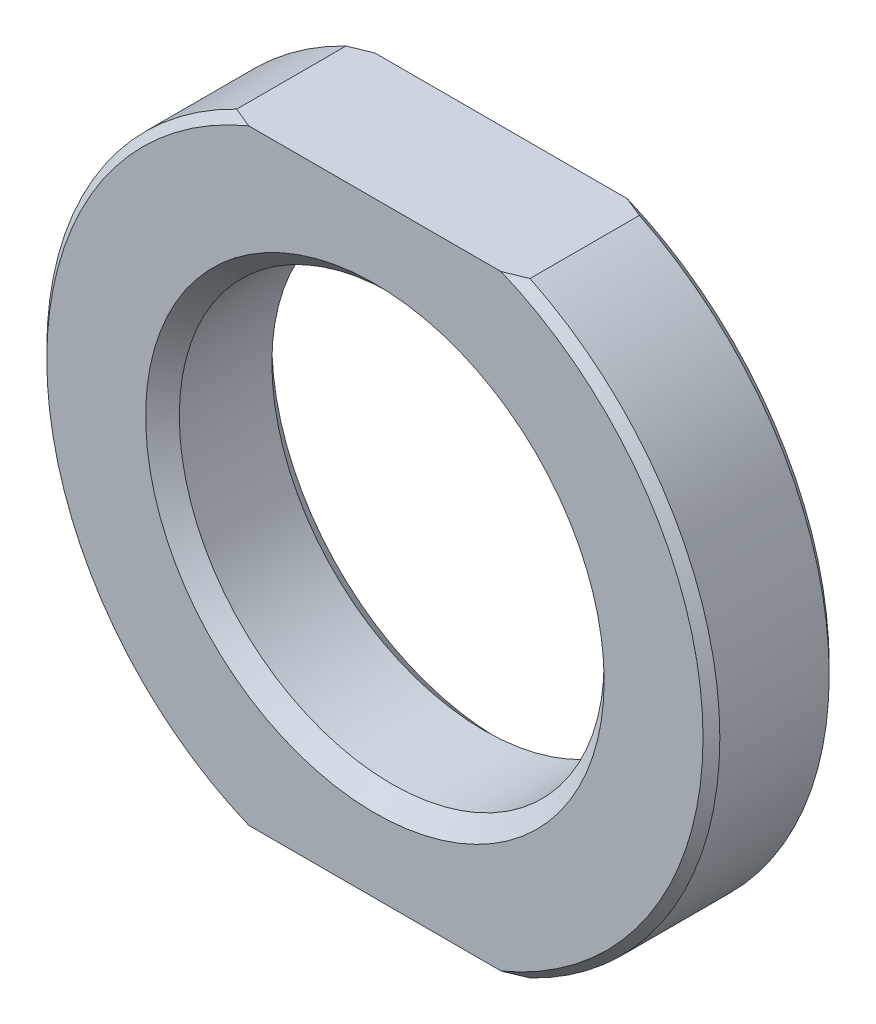
ISO-10303-21;
HEADER;
FILE_DESCRIPTION(('STEP AP214'),'2;1');
FILE_NAME('part.step','',(''),(''),'','','');
FILE_SCHEMA(('AUTOMOTIVE_DESIGN { 1 0 10303 214 1 1 1 1 }'));
ENDSEC;
DATA;
#1=APPLICATION_CONTEXT('core data for automotive mechanical design processes');
#2=APPLICATION_PROTOCOL_DEFINITION('international standard','automotive_design',2000,#1);
#3=PRODUCT_CONTEXT('',#1,'mechanical');
#4=PRODUCT('Part','Part','',(#3));
#5=PRODUCT_RELATED_PRODUCT_CATEGORY('part','',(#4));
#6=PRODUCT_DEFINITION_FORMATION('','',#4);
#7=PRODUCT_DEFINITION_CONTEXT('part definition',#1,'design');
#8=PRODUCT_DEFINITION('design','',#6,#7);
#9=PRODUCT_DEFINITION_SHAPE('','',#8);
#10=(LENGTH_UNIT() NAMED_UNIT(*) SI_UNIT(.MILLI.,.METRE.));
#11=(NAMED_UNIT(*) PLANE_ANGLE_UNIT() SI_UNIT($,.RADIAN.));
#12=(NAMED_UNIT(*) SI_UNIT($,.STERADIAN.) SOLID_ANGLE_UNIT());
#13=UNCERTAINTY_MEASURE_WITH_UNIT(LENGTH_MEASURE(1.E-05),#10,'distance_accuracy_value','');
#14=(GEOMETRIC_REPRESENTATION_CONTEXT(3) GLOBAL_UNCERTAINTY_ASSIGNED_CONTEXT((#13)) GLOBAL_UNIT_ASSIGNED_CONTEXT((#10,
#11,#12)) REPRESENTATION_CONTEXT('',''));
#15=CARTESIAN_POINT('',(0.,0.,0.));
#16=DIRECTION('',(0.,0.,1.));
#17=DIRECTION('',(1.,0.,0.));
#18=AXIS2_PLACEMENT_3D('',#15,#16,#17);
#19=CARTESIAN_POINT('',(0.,0.,15.));
#20=DIRECTION('',(0.,0.,-1.));
#21=DIRECTION('',(-1.,0.,0.));
#22=AXIS2_PLACEMENT_3D('',#19,#20,#21);
#23=CYLINDRICAL_SURFACE('',#22,40.);
#24=CARTESIAN_POINT('',(0.,0.,14.));
#25=DIRECTION('',(0.,0.,1.));
#26=DIRECTION('',(1.,0.,0.));
#27=AXIS2_PLACEMENT_3D('',#24,#25,#26);
#28=CIRCLE('',#27,40.);
#29=CARTESIAN_POINT('',(17.4355957741627,36.,14.));
#30=VERTEX_POINT('',#29);
#31=CARTESIAN_POINT('',(17.4355957741627,-36.,14.));
#32=VERTEX_POINT('',#31);
#33=EDGE_CURVE('E113',#30,#32,#28,.F.);
#34=ORIENTED_EDGE('',*,*,#33,.T.);
#35=DIRECTION('',(0.,0.,-1.));
#36=VECTOR('',#35,1.);
#37=CARTESIAN_POINT('',(17.4355957741627,-36.,15.));
#38=LINE('',#37,#36);
#39=CARTESIAN_POINT('',(17.4355957741627,-36.,0.999999999999994));
#40=VERTEX_POINT('',#39);
#41=EDGE_CURVE('E97',#40,#32,#38,.F.);
#42=ORIENTED_EDGE('',*,*,#41,.F.);
#43=CARTESIAN_POINT('',(0.,0.,0.999999999999994));
#44=DIRECTION('',(0.,0.,1.));
#45=DIRECTION('',(1.,0.,0.));
#46=AXIS2_PLACEMENT_3D('',#43,#44,#45);
#47=CIRCLE('',#46,40.);
#48=CARTESIAN_POINT('',(17.4355957741627,36.,0.999999999999994));
#49=VERTEX_POINT('',#48);
#50=EDGE_CURVE('E125',#40,#49,#47,.T.);
#51=ORIENTED_EDGE('',*,*,#50,.T.);
#52=DIRECTION('',(0.,0.,-1.));
#53=VECTOR('',#52,1.);
#54=CARTESIAN_POINT('',(17.4355957741627,36.,15.));
#55=LINE('',#54,#53);
#56=EDGE_CURVE('E119',#30,#49,#55,.T.);
#57=ORIENTED_EDGE('',*,*,#56,.F.);
#58=EDGE_LOOP('',(#34,#42,#51,#57));
#59=FACE_BOUND('',#58,.T.);
#60=ADVANCED_FACE('F34',(#59),#23,.T.);
#61=CARTESIAN_POINT('',(0.,0.,15.));
#62=DIRECTION('',(0.,0.,-1.));
#63=DIRECTION('',(-1.,0.,0.));
#64=AXIS2_PLACEMENT_3D('',#61,#62,#63);
#65=CONICAL_SURFACE('',#64,39.,0.785398163397438);
#66=CARTESIAN_POINT('',(-77.825600004695,-36.,-31.7486094119954));
#67=CARTESIAN_POINT('',(-76.6881741281828,-36.,-30.7163120926248));
#68=CARTESIAN_POINT('',(-75.5487915250788,-36.,-29.6861648322509));
#69=CARTESIAN_POINT('',(-73.2655470649654,-36.,-27.6308257342061));
#70=CARTESIAN_POINT('',(-72.1216851662086,-36.,-26.6056339429207));
#71=CARTESIAN_POINT('',(-69.8286249351588,-36.,-24.5606016035495));
#72=CARTESIAN_POINT('',(-68.6794252327062,-36.,-23.5407625909587));
#73=CARTESIAN_POINT('',(-66.3753243492236,-36.,-21.5075480323083));
#74=CARTESIAN_POINT('',(-65.2204231815443,-36.,-20.4941724711265));
#75=CARTESIAN_POINT('',(-62.8943951622492,-36.,-18.4663890947174));
#76=CARTESIAN_POINT('',(-61.7232135038202,-36.,-17.4520441078319));
#77=CARTESIAN_POINT('',(-59.3732783640983,-36.,-15.4321648820889));
#78=CARTESIAN_POINT('',(-58.194524909544,-36.,-14.4266306121472));
#79=CARTESIAN_POINT('',(-55.8284448889604,-36.,-12.4260209809316));
#80=CARTESIAN_POINT('',(-54.6411195184891,-36.,-11.430944206899));
#81=CARTESIAN_POINT('',(-52.256346114857,-36.,-9.45298868945021));
#82=CARTESIAN_POINT('',(-51.0588981218762,-36.,-8.47010989765447));
#83=CARTESIAN_POINT('',(-48.8046599535697,-36.,-6.6425304791211));
#84=CARTESIAN_POINT('',(-47.7492720948121,-36.,-5.79610151498913));
#85=CARTESIAN_POINT('',(-45.6281233248411,-36.,-4.11631502947676));
#86=CARTESIAN_POINT('',(-44.5623623709865,-36.,-3.28295756186667));
#87=CARTESIAN_POINT('',(-42.418469831393,-36.,-1.63145768460364));
#88=CARTESIAN_POINT('',(-41.3403338250807,-36.,-0.81332100404254));
#89=CARTESIAN_POINT('',(-39.1701727531055,-36.,0.804332167596225));
#90=CARTESIAN_POINT('',(-38.0781478370549,-36.,1.60384885898725));
#91=CARTESIAN_POINT('',(-35.8799087250404,-36.,3.1789329586558));
#92=CARTESIAN_POINT('',(-34.7737238248943,-36.,3.95454113719093));
#93=CARTESIAN_POINT('',(-32.5424990953004,-36.,5.47835548541539));
#94=CARTESIAN_POINT('',(-31.4174581969774,-36.,6.22656009399011));
#95=CARTESIAN_POINT('',(-29.1461314339693,-36.,7.68864629136478));
#96=CARTESIAN_POINT('',(-27.9998591873698,-36.,8.40254889309455));
#97=CARTESIAN_POINT('',(-26.2615414746248,-36.,9.44157261170722));
#98=CARTESIAN_POINT('',(-25.6789796206342,-36.,9.78259292760825));
#99=CARTESIAN_POINT('',(-24.5070590262419,-36.,10.4527303791024));
#100=CARTESIAN_POINT('',(-23.9177005240668,-36.,10.7818479302323));
#101=CARTESIAN_POINT('',(-22.7574674220638,-36.,11.4127278201935));
#102=CARTESIAN_POINT('',(-22.1869017058656,-36.,11.7150574254629));
#103=CARTESIAN_POINT('',(-21.0387319883516,-36.,12.3060439852695));
#104=CARTESIAN_POINT('',(-20.4611280794491,-36.,12.5947011190869));
#105=CARTESIAN_POINT('',(-19.2984250168128,-36.,13.1567605208321));
#106=CARTESIAN_POINT('',(-18.7133249482622,-36.,13.4301609046255));
#107=CARTESIAN_POINT('',(-17.5354582302939,-36.,13.9598255615374));
#108=CARTESIAN_POINT('',(-16.9426915693202,-36.,14.2160898088229));
#109=CARTESIAN_POINT('',(-15.1547161439953,-36.,14.9552943464983));
#110=CARTESIAN_POINT('',(-13.9474034125411,-36.,15.4098375841725));
#111=CARTESIAN_POINT('',(-12.1131972290979,-36.,16.0210931246126));
#112=CARTESIAN_POINT('',(-11.4979158817111,-36.,16.2130866949166));
#113=CARTESIAN_POINT('',(-10.2598997814196,-36.,16.5712065518105));
#114=CARTESIAN_POINT('',(-9.63716619167928,-36.,16.7373368199341));
#115=CARTESIAN_POINT('',(-8.49456496614814,-36.,17.0147785938789));
#116=CARTESIAN_POINT('',(-7.9757885484957,-36.,17.1305950157109));
#117=CARTESIAN_POINT('',(-6.93413892676897,-36.,17.3418187509319));
#118=CARTESIAN_POINT('',(-6.41126620074932,-36.,17.4372284101432));
#119=CARTESIAN_POINT('',(-5.36206892665025,-36.,17.6065421094496));
#120=CARTESIAN_POINT('',(-4.83574456699885,-36.,17.6804473136636));
#121=CARTESIAN_POINT('',(-3.78042037707287,-36.,17.8058415804808));
#122=CARTESIAN_POINT('',(-3.25142053931106,-36.,17.8573305803177));
#123=CARTESIAN_POINT('',(-2.19249394997177,-36.,17.9371557503005));
#124=CARTESIAN_POINT('',(-1.66256990027763,-36.,17.9655276320517));
#125=CARTESIAN_POINT('',(-0.601984344756694,-36.,17.9988686297367));
#126=CARTESIAN_POINT('',(-0.0713228406223323,-36.,18.0038377992905));
#127=CARTESIAN_POINT('',(0.989715223085071,-36.,17.9903051849976));
#128=CARTESIAN_POINT('',(1.52009177381774,-36.,17.9718027107799));
#129=CARTESIAN_POINT('',(2.57952048922698,-36.,17.9115777018653));
#130=CARTESIAN_POINT('',(3.10857265213097,-36.,17.8698551361068));
#131=CARTESIAN_POINT('',(4.16231887549279,-36.,17.7639520699464));
#132=CARTESIAN_POINT('',(4.68702189090346,-36.,17.699860335317));
#133=CARTESIAN_POINT('',(5.73336100601003,-36.,17.5499892888276));
#134=CARTESIAN_POINT('',(6.25499680025658,-36.,17.4642078532103));
#135=CARTESIAN_POINT('',(7.29440902729914,-36.,17.2719784439931));
#136=CARTESIAN_POINT('',(7.81218568200465,-36.,17.1655316683685));
#137=CARTESIAN_POINT('',(8.84335889759242,-36.,16.9331343435582));
#138=CARTESIAN_POINT('',(9.35675500294511,-36.,16.8071817914468));
#139=CARTESIAN_POINT('',(10.8921382704831,-36.,16.4012874740524));
#140=CARTESIAN_POINT('',(11.906959967691,-36.,16.0937556517087));
#141=CARTESIAN_POINT('',(13.4128329571344,-36.,15.5854128187504));
#142=CARTESIAN_POINT('',(13.9120687699164,-36.,15.4081224185008));
#143=CARTESIAN_POINT('',(14.9052051359921,-36.,15.0390873327156));
#144=CARTESIAN_POINT('',(15.3991055683949,-36.,14.8473423204446));
#145=CARTESIAN_POINT('',(16.6034125889464,-36.,14.3610345349559));
#146=CARTESIAN_POINT('',(17.3108611361208,-36.,14.0591457321206));
#147=CARTESIAN_POINT('',(18.7148614600208,-36.,13.4309002959307));
#148=CARTESIAN_POINT('',(19.4114118665068,-36.,13.1045406152256));
#149=CARTESIAN_POINT('',(20.7944065247033,-36.,12.4302677454143));
#150=CARTESIAN_POINT('',(21.4808455097021,-36.,12.0823437835559));
#151=CARTESIAN_POINT('',(22.8438606345863,-36.,11.3677917885468));
#152=CARTESIAN_POINT('',(23.5204371166838,-36.,11.0011644063691));
#153=CARTESIAN_POINT('',(24.8659144069751,-36.,10.2507000961244));
#154=CARTESIAN_POINT('',(25.5347949907003,-36.,9.86682698882233));
#155=CARTESIAN_POINT('',(26.8640550344519,-36.,9.08464981198027));
#156=CARTESIAN_POINT('',(27.5244344264634,-36.,8.68634562707964));
#157=CARTESIAN_POINT('',(28.8372130755793,-36.,7.87714465743607));
#158=CARTESIAN_POINT('',(29.4896141057546,-36.,7.46625074443496));
#159=CARTESIAN_POINT('',(30.7872264080707,-36.,6.633283323129));
#160=CARTESIAN_POINT('',(31.4324377018023,-36.,6.21120984840912));
#161=CARTESIAN_POINT('',(32.7227704388445,-36.,5.35284919972061));
#162=CARTESIAN_POINT('',(33.3678248731021,-36.,4.9164614005314));
#163=CARTESIAN_POINT('',(34.6517858020898,-36.,4.03472519713176));
#164=CARTESIAN_POINT('',(35.2906921945138,-36.,3.5893766441904));
#165=CARTESIAN_POINT('',(37.1990010563091,-36.,2.24139389141342));
#166=CARTESIAN_POINT('',(38.4599855423239,-36.,1.32682773166273));
#167=CARTESIAN_POINT('',(40.9615062519795,-36.,-0.526516888113715));
#168=CARTESIAN_POINT('',(42.2020660892232,-36.,-1.46526361764839));
#169=CARTESIAN_POINT('',(44.66730281408,-36.,-3.36331101502941));
#170=CARTESIAN_POINT('',(45.8919799523142,-36.,-4.32261135791512));
#171=CARTESIAN_POINT('',(48.4500104785156,-36.,-6.35512727868088));
#172=CARTESIAN_POINT('',(49.7819488628434,-36.,-7.4301208472556));
#173=CARTESIAN_POINT('',(52.4321794114827,-36.,-9.59678833182858));
#174=CARTESIAN_POINT('',(53.7504714873145,-36.,-10.6884623558658));
#175=CARTESIAN_POINT('',(56.3760301270857,-36.,-12.8860274127589));
#176=CARTESIAN_POINT('',(57.6832920965767,-36.,-13.9919239282641));
#177=CARTESIAN_POINT('',(60.2879680516296,-36.,-16.215232981045));
#178=CARTESIAN_POINT('',(61.585382073254,-36.,-17.3326454761147));
#179=CARTESIAN_POINT('',(64.1379477542404,-36.,-19.5478410432841));
#180=CARTESIAN_POINT('',(65.3933173206804,-36.,-20.6453732329271));
#181=CARTESIAN_POINT('',(67.897119595272,-36.,-22.8483248975273));
#182=CARTESIAN_POINT('',(69.1455522826578,-36.,-23.9537443960731));
#183=CARTESIAN_POINT('',(71.6356324338697,-36.,-26.1707064981913));
#184=CARTESIAN_POINT('',(72.8772834960022,-36.,-27.2822450628532));
#185=CARTESIAN_POINT('',(75.3552552283578,-36.,-29.511218207345));
#186=CARTESIAN_POINT('',(76.5915759650683,-36.,-30.6286527132431));
#187=CARTESIAN_POINT('',(77.825600004695,-36.,-31.7486094119954));
#188=B_SPLINE_CURVE_WITH_KNOTS('',3,(#66,#67,#68,#69,#70,#71,#72,#73,#74,#75,#76,#77,#78,#79,
#80,#81,#82,#83,#84,#85,#86,#87,#88,#89,#90,#91,#92,#93,#94,#95,#96,#97,#98,#99,#100,#101,#102,
#103,#104,#105,#106,#107,#108,#109,#110,#111,#112,#113,#114,#115,#116,#117,#118,#119,#120,#121,
#122,#123,#124,#125,#126,#127,#128,#129,#130,#131,#132,#133,#134,#135,#136,#137,#138,#139,#140,
#141,#142,#143,#144,#145,#146,#147,#148,#149,#150,#151,#152,#153,#154,#155,#156,#157,#158,#159,
#160,#161,#162,#163,#164,#165,#166,#167,#168,#169,#170,#171,#172,#173,#174,#175,#176,#177,#178,
#179,#180,#181,#182,#183,#184,#185,#186,#187),.UNSPECIFIED.,.F.,.F.,(4,2,2,2,2,2,2,2,2,2,2,2,2,
2,2,2,2,2,2,2,2,2,2,2,2,2,2,2,2,2,2,2,2,2,2,2,2,2,2,2,2,2,2,2,2,2,2,2,2,2,2,2,2,2,2,2,2,2,2,2,
4),(0.,4.60808069794762,9.21620444648132,13.8255848087619,18.4349543828032,23.0830413631657,
27.731111938522,32.3785462936651,37.0259622102838,41.08451737984,45.1430892401055,
49.2031590376283,53.2631851368301,57.3158546143595,61.368754604631,65.4191393371884,
67.4441337287951,69.4690573575464,71.4060377985327,73.3429928338247,75.2801865466449,
77.2173831797343,81.0836737352319,83.0168587226243,84.9497458103698,86.544016205573,
88.1381032357115,89.7321039557194,91.3261091389584,92.9176471898235,94.5091815941891,
96.1007628114172,97.6923461577129,99.2776842425625,100.863177616703,102.448579106803,
104.034143499895,107.212462261423,108.801652337636,110.390878347053,112.697832755627,
115.00507492714,117.313479153479,119.621803090512,121.935219063659,124.248653534108,
126.561564177542,128.874467873458,131.210781820108,133.547134577025,138.219867766125,
142.886753672156,147.553565847273,152.688284442007,157.823036308324,162.959830730854,
168.096606333745,173.099044658885,178.101497951107,183.100971880828,188.100383268393),.UNSPECIFIED.);
#189=CARTESIAN_POINT('',(15.,-36.,15.));
#190=VERTEX_POINT('',#189);
#191=EDGE_CURVE('E100',#190,#32,#188,.T.);
#192=ORIENTED_EDGE('',*,*,#191,.T.);
#193=ORIENTED_EDGE('',*,*,#33,.F.);
#194=CARTESIAN_POINT('',(77.8256000046949,36.,-31.7486094119954));
#195=CARTESIAN_POINT('',(76.6881741281828,36.,-30.7163120926248));
#196=CARTESIAN_POINT('',(75.5487915250788,36.,-29.6861648322509));
#197=CARTESIAN_POINT('',(73.2655470649654,36.,-27.6308257342061));
#198=CARTESIAN_POINT('',(72.1216851662085,36.,-26.6056339429207));
#199=CARTESIAN_POINT('',(69.8286249351587,36.,-24.5606016035495));
#200=CARTESIAN_POINT('',(68.6794252327062,36.,-23.5407625909587));
#201=CARTESIAN_POINT('',(66.3753243492236,36.,-21.5075480323083));
#202=CARTESIAN_POINT('',(65.2204231815442,36.,-20.4941724711265));
#203=CARTESIAN_POINT('',(62.8943951622492,36.,-18.4663890947174));
#204=CARTESIAN_POINT('',(61.7232135038202,36.,-17.4520441078319));
#205=CARTESIAN_POINT('',(59.3732783640983,36.,-15.4321648820889));
#206=CARTESIAN_POINT('',(58.194524909544,36.,-14.4266306121472));
#207=CARTESIAN_POINT('',(55.8284448889604,36.,-12.4260209809316));
#208=CARTESIAN_POINT('',(54.6411195184891,36.,-11.430944206899));
#209=CARTESIAN_POINT('',(52.256346114857,36.,-9.45298868945019));
#210=CARTESIAN_POINT('',(51.0588981218762,36.,-8.47010989765446));
#211=CARTESIAN_POINT('',(48.8046599535697,36.,-6.6425304791211));
#212=CARTESIAN_POINT('',(47.7492720948121,36.,-5.79610151498912));
#213=CARTESIAN_POINT('',(45.628123324841,36.,-4.11631502947675));
#214=CARTESIAN_POINT('',(44.5623623709865,36.,-3.28295756186666));
#215=CARTESIAN_POINT('',(42.418469831393,36.,-1.63145768460363));
#216=CARTESIAN_POINT('',(41.3403338250806,36.,-0.813321004042536));
#217=CARTESIAN_POINT('',(39.1701727531055,36.,0.80433216759623));
#218=CARTESIAN_POINT('',(38.0781478370549,36.,1.60384885898726));
#219=CARTESIAN_POINT('',(35.8799087250404,36.,3.17893295865581));
#220=CARTESIAN_POINT('',(34.7737238248943,36.,3.95454113719093));
#221=CARTESIAN_POINT('',(32.5424990953004,36.,5.47835548541539));
#222=CARTESIAN_POINT('',(31.4174581969774,36.,6.22656009399011));
#223=CARTESIAN_POINT('',(29.1461314339693,36.,7.68864629136478));
#224=CARTESIAN_POINT('',(27.9998591873698,36.,8.40254889309455));
#225=CARTESIAN_POINT('',(26.2615414746248,36.,9.44157261170722));
#226=CARTESIAN_POINT('',(25.6789796206342,36.,9.78259292760825));
#227=CARTESIAN_POINT('',(24.5070590262419,36.,10.4527303791024));
#228=CARTESIAN_POINT('',(23.9177005240668,36.,10.7818479302323));
#229=CARTESIAN_POINT('',(22.7574674220638,36.,11.4127278201935));
#230=CARTESIAN_POINT('',(22.1869017058656,36.,11.7150574254629));
#231=CARTESIAN_POINT('',(21.0387319883516,36.,12.3060439852695));
#232=CARTESIAN_POINT('',(20.4611280794491,36.,12.5947011190869));
#233=CARTESIAN_POINT('',(19.2984250168128,36.,13.1567605208321));
#234=CARTESIAN_POINT('',(18.7133249482622,36.,13.4301609046255));
#235=CARTESIAN_POINT('',(17.5354582302939,36.,13.9598255615374));
#236=CARTESIAN_POINT('',(16.9426915693202,36.,14.2160898088229));
#237=CARTESIAN_POINT('',(15.1547161439953,36.,14.9552943464983));
#238=CARTESIAN_POINT('',(13.9474034125411,36.,15.4098375841725));
#239=CARTESIAN_POINT('',(12.1131972290979,36.,16.0210931246126));
#240=CARTESIAN_POINT('',(11.4979158817111,36.,16.2130866949166));
#241=CARTESIAN_POINT('',(10.2598997814196,36.,16.5712065518105));
#242=CARTESIAN_POINT('',(9.63716619167928,36.,16.7373368199341));
#243=CARTESIAN_POINT('',(8.49456496614814,36.,17.0147785938789));
#244=CARTESIAN_POINT('',(7.97578854849569,36.,17.1305950157109));
#245=CARTESIAN_POINT('',(6.93413892676895,36.,17.3418187509319));
#246=CARTESIAN_POINT('',(6.41126620074931,36.,17.4372284101432));
#247=CARTESIAN_POINT('',(5.36206892665023,36.,17.6065421094496));
#248=CARTESIAN_POINT('',(4.83574456699884,36.,17.6804473136636));
#249=CARTESIAN_POINT('',(3.78042037707286,36.,17.8058415804808));
#250=CARTESIAN_POINT('',(3.25142053931105,36.,17.8573305803177));
#251=CARTESIAN_POINT('',(2.19249394997175,36.,17.9371557503005));
#252=CARTESIAN_POINT('',(1.66256990027761,36.,17.9655276320517));
#253=CARTESIAN_POINT('',(0.60198434475668,36.,17.9988686297367));
#254=CARTESIAN_POINT('',(0.0713228406223235,36.,18.0038377992905));
#255=CARTESIAN_POINT('',(-0.989715223085075,36.,17.9903051849976));
#256=CARTESIAN_POINT('',(-1.52009177381774,36.,17.9718027107799));
#257=CARTESIAN_POINT('',(-2.57952048922699,36.,17.9115777018653));
#258=CARTESIAN_POINT('',(-3.10857265213098,36.,17.8698551361068));
#259=CARTESIAN_POINT('',(-4.16231887549279,36.,17.7639520699464));
#260=CARTESIAN_POINT('',(-4.68702189090347,36.,17.699860335317));
#261=CARTESIAN_POINT('',(-5.73336100601003,36.,17.5499892888276));
#262=CARTESIAN_POINT('',(-6.25499680025658,36.,17.4642078532103));
#263=CARTESIAN_POINT('',(-7.29440902729914,36.,17.2719784439931));
#264=CARTESIAN_POINT('',(-7.81218568200465,36.,17.1655316683685));
#265=CARTESIAN_POINT('',(-8.84335889759241,36.,16.9331343435582));
#266=CARTESIAN_POINT('',(-9.35675500294511,36.,16.8071817914468));
#267=CARTESIAN_POINT('',(-10.8921382704831,36.,16.4012874740524));
#268=CARTESIAN_POINT('',(-11.906959967691,36.,16.0937556517087));
#269=CARTESIAN_POINT('',(-13.4128329571344,36.,15.5854128187504));
#270=CARTESIAN_POINT('',(-13.9120687699164,36.,15.4081224185008));
#271=CARTESIAN_POINT('',(-14.9052051359921,36.,15.0390873327156));
#272=CARTESIAN_POINT('',(-15.3991055683949,36.,14.8473423204446));
#273=CARTESIAN_POINT('',(-16.6034125889464,36.,14.3610345349559));
#274=CARTESIAN_POINT('',(-17.3108611361208,36.,14.0591457321206));
#275=CARTESIAN_POINT('',(-18.7148614600208,36.,13.4309002959307));
#276=CARTESIAN_POINT('',(-19.4114118665068,36.,13.1045406152256));
#277=CARTESIAN_POINT('',(-20.7944065247034,36.,12.4302677454143));
#278=CARTESIAN_POINT('',(-21.4808455097021,36.,12.0823437835559));
#279=CARTESIAN_POINT('',(-22.8438606345863,36.,11.3677917885468));
#280=CARTESIAN_POINT('',(-23.5204371166838,36.,11.0011644063691));
#281=CARTESIAN_POINT('',(-24.8659144069751,36.,10.2507000961244));
#282=CARTESIAN_POINT('',(-25.5347949907003,36.,9.86682698882232));
#283=CARTESIAN_POINT('',(-26.8640550344519,36.,9.08464981198026));
#284=CARTESIAN_POINT('',(-27.5244344264634,36.,8.68634562707963));
#285=CARTESIAN_POINT('',(-28.8372130755793,36.,7.87714465743605));
#286=CARTESIAN_POINT('',(-29.4896141057546,36.,7.46625074443494));
#287=CARTESIAN_POINT('',(-30.7872264080707,36.,6.63328332312899));
#288=CARTESIAN_POINT('',(-31.4324377018023,36.,6.2112098484091));
#289=CARTESIAN_POINT('',(-32.7227704388445,36.,5.35284919972059));
#290=CARTESIAN_POINT('',(-33.3678248731021,36.,4.91646140053138));
#291=CARTESIAN_POINT('',(-34.6517858020898,36.,4.03472519713175));
#292=CARTESIAN_POINT('',(-35.2906921945138,36.,3.58937664419039));
#293=CARTESIAN_POINT('',(-37.1990010563091,36.,2.2413938914134));
#294=CARTESIAN_POINT('',(-38.4599855423239,36.,1.32682773166271));
#295=CARTESIAN_POINT('',(-40.9615062519796,36.,-0.526516888113741));
#296=CARTESIAN_POINT('',(-42.2020660892232,36.,-1.46526361764843));
#297=CARTESIAN_POINT('',(-44.6673028140801,36.,-3.36331101502945));
#298=CARTESIAN_POINT('',(-45.8919799523142,36.,-4.32261135791515));
#299=CARTESIAN_POINT('',(-48.4500104785156,36.,-6.35512727868092));
#300=CARTESIAN_POINT('',(-49.7819488628435,36.,-7.43012084725565));
#301=CARTESIAN_POINT('',(-52.4321794114828,36.,-9.59678833182864));
#302=CARTESIAN_POINT('',(-53.7504714873145,36.,-10.6884623558659));
#303=CARTESIAN_POINT('',(-56.3760301270858,36.,-12.8860274127589));
#304=CARTESIAN_POINT('',(-57.6832920965767,36.,-13.9919239282641));
#305=CARTESIAN_POINT('',(-60.2879680516296,36.,-16.215232981045));
#306=CARTESIAN_POINT('',(-61.585382073254,36.,-17.3326454761147));
#307=CARTESIAN_POINT('',(-64.1379477542405,36.,-19.5478410432842));
#308=CARTESIAN_POINT('',(-65.3933173206804,36.,-20.6453732329271));
#309=CARTESIAN_POINT('',(-67.8971195952721,36.,-22.8483248975273));
#310=CARTESIAN_POINT('',(-69.1455522826578,36.,-23.9537443960731));
#311=CARTESIAN_POINT('',(-71.6356324338697,36.,-26.1707064981913));
#312=CARTESIAN_POINT('',(-72.8772834960023,36.,-27.2822450628532));
#313=CARTESIAN_POINT('',(-75.3552552283578,36.,-29.511218207345));
#314=CARTESIAN_POINT('',(-76.5915759650683,36.,-30.6286527132431));
#315=CARTESIAN_POINT('',(-77.825600004695,36.,-31.7486094119954));
#316=B_SPLINE_CURVE_WITH_KNOTS('',3,(#194,#195,#196,#197,#198,#199,#200,#201,#202,#203,#204,
#205,#206,#207,#208,#209,#210,#211,#212,#213,#214,#215,#216,#217,#218,#219,#220,#221,#222,#223,
#224,#225,#226,#227,#228,#229,#230,#231,#232,#233,#234,#235,#236,#237,#238,#239,#240,#241,#242,
#243,#244,#245,#246,#247,#248,#249,#250,#251,#252,#253,#254,#255,#256,#257,#258,#259,#260,#261,
#262,#263,#264,#265,#266,#267,#268,#269,#270,#271,#272,#273,#274,#275,#276,#277,#278,#279,#280,
#281,#282,#283,#284,#285,#286,#287,#288,#289,#290,#291,#292,#293,#294,#295,#296,#297,#298,#299,
#300,#301,#302,#303,#304,#305,#306,#307,#308,#309,#310,#311,#312,#313,#314,#315),.UNSPECIFIED.,
.F.,.F.,(4,2,2,2,2,2,2,2,2,2,2,2,2,2,2,2,2,2,2,2,2,2,2,2,2,2,2,2,2,2,2,2,2,2,2,2,2,2,2,2,2,2,2,
2,2,2,2,2,2,2,2,2,2,2,2,2,2,2,2,2,4),(0.,4.60808069794763,9.21620444648134,13.825584808762,
18.4349543828031,23.0830413631657,27.731111938522,32.3785462936651,37.0259622102838,
41.08451737984,45.1430892401055,49.2031590376283,53.2631851368301,57.3158546143595,
61.3687546046309,65.4191393371884,67.4441337287951,69.4690573575463,71.4060377985327,
73.3429928338247,75.2801865466449,77.2173831797343,81.0836737352319,83.0168587226243,
84.9497458103698,86.5440162055731,88.1381032357115,89.7321039557194,91.3261091389585,
92.9176471898235,94.5091815941892,96.1007628114173,97.6923461577129,99.2776842425625,
100.863177616703,102.448579106803,104.034143499895,107.212462261423,108.801652337636,
110.390878347053,112.697832755627,115.00507492714,117.313479153479,119.621803090512,
121.935219063659,124.248653534108,126.561564177542,128.874467873458,131.210781820108,
133.547134577025,138.219867766125,142.886753672156,147.553565847273,152.688284442007,
157.823036308324,162.959830730854,168.096606333745,173.099044658885,178.101497951107,
183.100971880828,188.100383268393),.UNSPECIFIED.);
#317=CARTESIAN_POINT('',(15.,36.,15.));
#318=VERTEX_POINT('',#317);
#319=EDGE_CURVE('E171',#30,#318,#316,.T.);
#320=ORIENTED_EDGE('',*,*,#319,.T.);
#321=CARTESIAN_POINT('',(0.,0.,15.));
#322=DIRECTION('',(0.,0.,1.));
#323=DIRECTION('',(1.,0.,0.));
#324=AXIS2_PLACEMENT_3D('',#321,#322,#323);
#325=CIRCLE('',#324,39.);
#326=EDGE_CURVE('E114',#190,#318,#325,.T.);
#327=ORIENTED_EDGE('',*,*,#326,.F.);
#328=EDGE_LOOP('',(#192,#193,#320,#327));
#329=FACE_BOUND('',#328,.T.);
#330=ADVANCED_FACE('F111',(#329),#65,.T.);
#331=CARTESIAN_POINT('',(0.,0.,0.999999999999994));
#332=DIRECTION('',(0.,0.,1.));
#333=DIRECTION('',(1.,0.,0.));
#334=AXIS2_PLACEMENT_3D('',#331,#332,#333);
#335=CONICAL_SURFACE('',#334,40.,0.785398163397452);
#336=CARTESIAN_POINT('',(77.8256000046964,-36.,46.7486094119953));
#337=CARTESIAN_POINT('',(76.6881741281842,-36.,45.7163120926247));
#338=CARTESIAN_POINT('',(75.5487915250801,-36.,44.6861648322509));
#339=CARTESIAN_POINT('',(73.2655470649666,-36.,42.630825734206));
#340=CARTESIAN_POINT('',(72.1216851662097,-36.,41.6056339429206));
#341=CARTESIAN_POINT('',(69.8286249351598,-36.,39.5606016035493));
#342=CARTESIAN_POINT('',(68.6794252327072,-36.,38.5407625909585));
#343=CARTESIAN_POINT('',(66.3753243492246,-36.,36.5075480323081));
#344=CARTESIAN_POINT('',(65.2204231815452,-36.,35.4941724711263));
#345=CARTESIAN_POINT('',(62.89439516225,-36.,33.4663890947172));
#346=CARTESIAN_POINT('',(61.723213503821,-36.,32.4520441078317));
#347=CARTESIAN_POINT('',(59.373278364099,-36.,30.4321648820886));
#348=CARTESIAN_POINT('',(58.1945249095446,-36.,29.4266306121469));
#349=CARTESIAN_POINT('',(55.8284448889609,-36.,27.4260209809313));
#350=CARTESIAN_POINT('',(54.6411195184896,-36.,26.4309442068987));
#351=CARTESIAN_POINT('',(52.2563461148574,-36.,24.4529886894499));
#352=CARTESIAN_POINT('',(51.0588981218765,-36.,23.4701098976541));
#353=CARTESIAN_POINT('',(48.80465995357,-36.,21.6425304791207));
#354=CARTESIAN_POINT('',(47.7492720948123,-36.,20.7961015149887));
#355=CARTESIAN_POINT('',(45.6281233248411,-36.,19.1163150294762));
#356=CARTESIAN_POINT('',(44.5623623709864,-36.,18.2829575618661));
#357=CARTESIAN_POINT('',(42.4184698313928,-36.,16.631457684603));
#358=CARTESIAN_POINT('',(41.3403338250804,-36.,15.8133210040419));
#359=CARTESIAN_POINT('',(39.1701727531051,-36.,14.1956678324031));
#360=CARTESIAN_POINT('',(38.0781478370544,-36.,13.396151141012));
#361=CARTESIAN_POINT('',(35.8799087250397,-36.,11.8210670413434));
#362=CARTESIAN_POINT('',(34.7737238248936,-36.,11.0454588628083));
#363=CARTESIAN_POINT('',(32.5424990952995,-36.,9.52164451458379));
#364=CARTESIAN_POINT('',(31.4174581969765,-36.,8.77343990600904));
#365=CARTESIAN_POINT('',(29.1461314339682,-36.,7.31135370863435));
#366=CARTESIAN_POINT('',(27.9998591873686,-36.,6.59745110690456));
#367=CARTESIAN_POINT('',(26.2615414746236,-36.,5.55842738829188));
#368=CARTESIAN_POINT('',(25.6789796206329,-36.,5.21740707239084));
#369=CARTESIAN_POINT('',(24.5070590262405,-36.,4.54726962089673));
#370=CARTESIAN_POINT('',(23.9177005240654,-36.,4.21815206976682));
#371=CARTESIAN_POINT('',(22.7574674220623,-36.,3.58727217980563));
#372=CARTESIAN_POINT('',(22.1869017058641,-36.,3.28494257453626));
#373=CARTESIAN_POINT('',(21.0387319883501,-36.,2.69395601472972));
#374=CARTESIAN_POINT('',(20.4611280794476,-36.,2.40529888091225));
#375=CARTESIAN_POINT('',(19.2984250168112,-36.,1.84323947916715));
#376=CARTESIAN_POINT('',(18.7133249482607,-36.,1.56983909537373));
#377=CARTESIAN_POINT('',(17.5354582302923,-36.,1.04017443846192));
#378=CARTESIAN_POINT('',(16.9426915693186,-36.,0.783910191176382));
#379=CARTESIAN_POINT('',(15.1547161439937,-36.,0.0447056535010591));
#380=CARTESIAN_POINT('',(13.9474034125395,-36.,-0.409837584173046));
#381=CARTESIAN_POINT('',(12.1131972290963,-36.,-1.02109312461305));
#382=CARTESIAN_POINT('',(11.4979158817095,-36.,-1.21308669491702));
#383=CARTESIAN_POINT('',(10.259899781418,-36.,-1.57120655181087));
#384=CARTESIAN_POINT('',(9.63716619167767,-36.,-1.73733681993442));
#385=CARTESIAN_POINT('',(8.49456496614651,-36.,-2.01477859387923));
#386=CARTESIAN_POINT('',(7.97578854849405,-36.,-2.13059501571117));
#387=CARTESIAN_POINT('',(6.93413892676729,-36.,-2.34181875093217));
#388=CARTESIAN_POINT('',(6.41126620074762,-36.,-2.43722841014347));
#389=CARTESIAN_POINT('',(5.36206892664852,-36.,-2.6065421094498));
#390=CARTESIAN_POINT('',(4.83574456699711,-36.,-2.68044731366378));
#391=CARTESIAN_POINT('',(3.78042037707112,-36.,-2.80584158048086));
#392=CARTESIAN_POINT('',(3.25142053930929,-36.,-2.85733058031778));
#393=CARTESIAN_POINT('',(2.19249394996996,-36.,-2.93715575030056));
#394=CARTESIAN_POINT('',(1.6625699002758,-36.,-2.96552763205167));
#395=CARTESIAN_POINT('',(0.601984344754853,-36.,-2.99886862973668));
#396=CARTESIAN_POINT('',(0.0713228406204863,-36.,-3.00383779929037));
#397=CARTESIAN_POINT('',(-0.98971522308693,-36.,-2.99030518499747));
#398=CARTESIAN_POINT('',(-1.52009177381961,-36.,-2.97180271077978));
#399=CARTESIAN_POINT('',(-2.57952048922887,-36.,-2.91157770186513));
#400=CARTESIAN_POINT('',(-3.10857265213286,-36.,-2.86985513610659));
#401=CARTESIAN_POINT('',(-4.16231887549469,-36.,-2.76395206994609));
#402=CARTESIAN_POINT('',(-4.68702189090537,-36.,-2.69986033531664));
#403=CARTESIAN_POINT('',(-5.73336100601195,-36.,-2.54998928882725));
#404=CARTESIAN_POINT('',(-6.2549968002585,-36.,-2.46420785320986));
#405=CARTESIAN_POINT('',(-7.29440902730106,-36.,-2.27197844399263));
#406=CARTESIAN_POINT('',(-7.81218568200658,-36.,-2.16553166836805));
#407=CARTESIAN_POINT('',(-8.84335889759435,-36.,-1.9331343435577));
#408=CARTESIAN_POINT('',(-9.35675500294705,-36.,-1.80718179144629));
#409=CARTESIAN_POINT('',(-10.892138270485,-36.,-1.40128747405176));
#410=CARTESIAN_POINT('',(-11.9069599676929,-36.,-1.09375565170809));
#411=CARTESIAN_POINT('',(-13.4128329571363,-36.,-0.585412818749747));
#412=CARTESIAN_POINT('',(-13.9120687699183,-36.,-0.408122418500078));
#413=CARTESIAN_POINT('',(-14.905205135994,-36.,-0.0390873327148355));
#414=CARTESIAN_POINT('',(-15.3991055683968,-36.,0.152657679556194));
#415=CARTESIAN_POINT('',(-16.6034125889485,-36.,0.638965465044937));
#416=CARTESIAN_POINT('',(-17.310861136123,-36.,0.940854267880327));
#417=CARTESIAN_POINT('',(-18.7148614600233,-36.,1.56909970407042));
#418=CARTESIAN_POINT('',(-19.4114118665094,-36.,1.89545938477559));
#419=CARTESIAN_POINT('',(-20.7944065247062,-36.,2.56973225458705));
#420=CARTESIAN_POINT('',(-21.4808455097051,-36.,2.91765621644558));
#421=CARTESIAN_POINT('',(-22.8438606345895,-36.,3.63220821145481));
#422=CARTESIAN_POINT('',(-23.5204371166871,-36.,3.99883559363265));
#423=CARTESIAN_POINT('',(-24.8659144069787,-36.,4.74929990387753));
#424=CARTESIAN_POINT('',(-25.534794990704,-36.,5.13317301117969));
#425=CARTESIAN_POINT('',(-26.8640550344558,-36.,5.91535018802195));
#426=CARTESIAN_POINT('',(-27.5244344264674,-36.,6.31365437292267));
#427=CARTESIAN_POINT('',(-28.8372130755836,-36.,7.12285534256643));
#428=CARTESIAN_POINT('',(-29.489614105759,-36.,7.53374925556763));
#429=CARTESIAN_POINT('',(-30.7872264080754,-36.,8.36671667687379));
#430=CARTESIAN_POINT('',(-31.4324377018071,-36.,8.78879015159377));
#431=CARTESIAN_POINT('',(-32.7227704388495,-36.,9.64715080028249));
#432=CARTESIAN_POINT('',(-33.3678248731072,-36.,10.0835385994718));
#433=CARTESIAN_POINT('',(-34.6517858020951,-36.,10.9652748028716));
#434=CARTESIAN_POINT('',(-35.2906921945192,-36.,11.4106233558131));
#435=CARTESIAN_POINT('',(-37.1990010563149,-36.,12.7586061085904));
#436=CARTESIAN_POINT('',(-38.4599855423299,-36.,13.6731722683413));
#437=CARTESIAN_POINT('',(-40.961506251986,-36.,15.5265168881181));
#438=CARTESIAN_POINT('',(-42.2020660892299,-36.,16.465263617653));
#439=CARTESIAN_POINT('',(-44.6673028140872,-36.,18.3633110150345));
#440=CARTESIAN_POINT('',(-45.8919799523215,-36.,19.3226113579204));
#441=CARTESIAN_POINT('',(-48.4500104785229,-36.,21.3551272786862));
#442=CARTESIAN_POINT('',(-49.7819488628504,-36.,22.4301208472607));
#443=CARTESIAN_POINT('',(-52.4321794114892,-36.,24.5967883318332));
#444=CARTESIAN_POINT('',(-53.7504714873206,-36.,25.6884623558702));
#445=CARTESIAN_POINT('',(-56.3760301270913,-36.,27.8860274127629));
#446=CARTESIAN_POINT('',(-57.683292096582,-36.,28.9919239282678));
#447=CARTESIAN_POINT('',(-60.2879680516344,-36.,31.2152329810482));
#448=CARTESIAN_POINT('',(-61.5853820732585,-36.,32.3326454761177));
#449=CARTESIAN_POINT('',(-64.1379477542445,-36.,34.5478410432867));
#450=CARTESIAN_POINT('',(-65.3933173206841,-36.,35.6453732329295));
#451=CARTESIAN_POINT('',(-67.8971195952753,-36.,37.8483248975292));
#452=CARTESIAN_POINT('',(-69.1455522826608,-36.,38.9537443960747));
#453=CARTESIAN_POINT('',(-71.6356324338722,-36.,41.1707064981924));
#454=CARTESIAN_POINT('',(-72.8772834960046,-36.,42.2822450628542));
#455=CARTESIAN_POINT('',(-75.3552552283597,-36.,44.5112182073454));
#456=CARTESIAN_POINT('',(-76.5915759650699,-36.,45.6286527132433));
#457=CARTESIAN_POINT('',(-77.8256000046964,-36.,46.7486094119954));
#458=B_SPLINE_CURVE_WITH_KNOTS('',3,(#336,#337,#338,#339,#340,#341,#342,#343,#344,#345,#346,
#347,#348,#349,#350,#351,#352,#353,#354,#355,#356,#357,#358,#359,#360,#361,#362,#363,#364,#365,
#366,#367,#368,#369,#370,#371,#372,#373,#374,#375,#376,#377,#378,#379,#380,#381,#382,#383,#384,
#385,#386,#387,#388,#389,#390,#391,#392,#393,#394,#395,#396,#397,#398,#399,#400,#401,#402,#403,
#404,#405,#406,#407,#408,#409,#410,#411,#412,#413,#414,#415,#416,#417,#418,#419,#420,#421,#422,
#423,#424,#425,#426,#427,#428,#429,#430,#431,#432,#433,#434,#435,#436,#437,#438,#439,#440,#441,
#442,#443,#444,#445,#446,#447,#448,#449,#450,#451,#452,#453,#454,#455,#456,#457),.UNSPECIFIED.,
.F.,.F.,(4,2,2,2,2,2,2,2,2,2,2,2,2,2,2,2,2,2,2,2,2,2,2,2,2,2,2,2,2,2,2,2,2,2,2,2,2,2,2,2,2,2,2,
2,2,2,2,2,2,2,2,2,2,2,2,2,2,2,2,2,4),(0.,4.60808069794776,9.21620444648159,13.8255848087623,
18.4349543828037,23.0830413631664,27.7311119385227,32.378546293666,37.0259622102848,
41.0845173798413,45.143089240107,49.20315903763,53.263185136832,57.3158546143617,
61.3687546046334,65.4191393371911,67.4441337287978,69.4690573575492,71.4060377985355,
73.3429928338275,75.2801865466477,77.2173831797371,81.0836737352347,83.016858722627,
84.9497458103725,86.5440162055758,88.1381032357143,89.7321039557222,91.3261091389613,
92.9176471898264,94.5091815941921,96.1007628114202,97.6923461577158,99.2776842425655,
100.863177616706,102.448579106806,104.034143499898,107.212462261426,108.801652337639,
110.390878347056,112.697832755631,115.005074927144,117.313479153483,119.621803090517,
121.935219063664,124.248653534114,126.561564177549,128.874467873465,131.210781820115,
133.547134577033,138.219867766134,142.886753672165,147.553565847283,152.688284442017,
157.823036308332,162.959830730861,168.096606333751,173.09904465889,178.101497951111,
183.100971880831,188.100383268395),.UNSPECIFIED.);
#459=CARTESIAN_POINT('',(-15.,-36.,0.));
#460=VERTEX_POINT('',#459);
#461=CARTESIAN_POINT('',(-17.4355957741627,-36.,0.999999999999994));
#462=VERTEX_POINT('',#461);
#463=EDGE_CURVE('E176',#460,#462,#458,.T.);
#464=ORIENTED_EDGE('',*,*,#463,.T.);
#465=CARTESIAN_POINT('',(-17.4355957741627,36.,0.999999999999994));
#466=VERTEX_POINT('',#465);
#467=EDGE_CURVE('E121',#466,#462,#47,.T.);
#468=ORIENTED_EDGE('',*,*,#467,.F.);
#469=CARTESIAN_POINT('',(-77.8256000046964,36.,46.7486094119953));
#470=CARTESIAN_POINT('',(-76.6881741281842,36.,45.7163120926247));
#471=CARTESIAN_POINT('',(-75.5487915250801,36.,44.6861648322509));
#472=CARTESIAN_POINT('',(-73.2655470649666,36.,42.630825734206));
#473=CARTESIAN_POINT('',(-72.1216851662097,36.,41.6056339429206));
#474=CARTESIAN_POINT('',(-69.8286249351598,36.,39.5606016035493));
#475=CARTESIAN_POINT('',(-68.6794252327072,36.,38.5407625909585));
#476=CARTESIAN_POINT('',(-66.3753243492246,36.,36.5075480323081));
#477=CARTESIAN_POINT('',(-65.2204231815452,36.,35.4941724711263));
#478=CARTESIAN_POINT('',(-62.89439516225,36.,33.4663890947172));
#479=CARTESIAN_POINT('',(-61.723213503821,36.,32.4520441078317));
#480=CARTESIAN_POINT('',(-59.373278364099,36.,30.4321648820886));
#481=CARTESIAN_POINT('',(-58.1945249095446,36.,29.4266306121469));
#482=CARTESIAN_POINT('',(-55.8284448889609,36.,27.4260209809313));
#483=CARTESIAN_POINT('',(-54.6411195184896,36.,26.4309442068987));
#484=CARTESIAN_POINT('',(-52.2563461148574,36.,24.4529886894499));
#485=CARTESIAN_POINT('',(-51.0588981218765,36.,23.4701098976541));
#486=CARTESIAN_POINT('',(-48.80465995357,36.,21.6425304791207));
#487=CARTESIAN_POINT('',(-47.7492720948123,36.,20.7961015149887));
#488=CARTESIAN_POINT('',(-45.6281233248411,36.,19.1163150294762));
#489=CARTESIAN_POINT('',(-44.5623623709864,36.,18.2829575618661));
#490=CARTESIAN_POINT('',(-42.4184698313928,36.,16.631457684603));
#491=CARTESIAN_POINT('',(-41.3403338250804,36.,15.8133210040419));
#492=CARTESIAN_POINT('',(-39.1701727531051,36.,14.1956678324031));
#493=CARTESIAN_POINT('',(-38.0781478370544,36.,13.396151141012));
#494=CARTESIAN_POINT('',(-35.8799087250397,36.,11.8210670413434));
#495=CARTESIAN_POINT('',(-34.7737238248936,36.,11.0454588628083));
#496=CARTESIAN_POINT('',(-32.5424990952995,36.,9.52164451458379));
#497=CARTESIAN_POINT('',(-31.4174581969765,36.,8.77343990600904));
#498=CARTESIAN_POINT('',(-29.1461314339682,36.,7.31135370863435));
#499=CARTESIAN_POINT('',(-27.9998591873686,36.,6.59745110690456));
#500=CARTESIAN_POINT('',(-26.2615414746236,36.,5.55842738829188));
#501=CARTESIAN_POINT('',(-25.6789796206329,36.,5.21740707239084));
#502=CARTESIAN_POINT('',(-24.5070590262405,36.,4.54726962089673));
#503=CARTESIAN_POINT('',(-23.9177005240654,36.,4.21815206976682));
#504=CARTESIAN_POINT('',(-22.7574674220623,36.,3.58727217980563));
#505=CARTESIAN_POINT('',(-22.1869017058641,36.,3.28494257453626));
#506=CARTESIAN_POINT('',(-21.0387319883501,36.,2.69395601472972));
#507=CARTESIAN_POINT('',(-20.4611280794476,36.,2.40529888091225));
#508=CARTESIAN_POINT('',(-19.2984250168112,36.,1.84323947916715));
#509=CARTESIAN_POINT('',(-18.7133249482607,36.,1.56983909537373));
#510=CARTESIAN_POINT('',(-17.5354582302923,36.,1.04017443846192));
#511=CARTESIAN_POINT('',(-16.9426915693186,36.,0.783910191176382));
#512=CARTESIAN_POINT('',(-15.1547161439937,36.,0.0447056535010591));
#513=CARTESIAN_POINT('',(-13.9474034125395,36.,-0.409837584173046));
#514=CARTESIAN_POINT('',(-12.1131972290963,36.,-1.02109312461305));
#515=CARTESIAN_POINT('',(-11.4979158817095,36.,-1.21308669491702));
#516=CARTESIAN_POINT('',(-10.259899781418,36.,-1.57120655181087));
#517=CARTESIAN_POINT('',(-9.63716619167767,36.,-1.73733681993442));
#518=CARTESIAN_POINT('',(-8.49456496614651,36.,-2.01477859387923));
#519=CARTESIAN_POINT('',(-7.97578854849405,36.,-2.13059501571117));
#520=CARTESIAN_POINT('',(-6.93413892676729,36.,-2.34181875093217));
#521=CARTESIAN_POINT('',(-6.41126620074762,36.,-2.43722841014347));
#522=CARTESIAN_POINT('',(-5.36206892664852,36.,-2.6065421094498));
#523=CARTESIAN_POINT('',(-4.83574456699711,36.,-2.68044731366378));
#524=CARTESIAN_POINT('',(-3.78042037707112,36.,-2.80584158048086));
#525=CARTESIAN_POINT('',(-3.25142053930929,36.,-2.85733058031778));
#526=CARTESIAN_POINT('',(-2.19249394996996,36.,-2.93715575030056));
#527=CARTESIAN_POINT('',(-1.6625699002758,36.,-2.96552763205167));
#528=CARTESIAN_POINT('',(-0.601984344754853,36.,-2.99886862973668));
#529=CARTESIAN_POINT('',(-0.0713228406204863,36.,-3.00383779929037));
#530=CARTESIAN_POINT('',(0.98971522308693,36.,-2.99030518499747));
#531=CARTESIAN_POINT('',(1.52009177381961,36.,-2.97180271077978));
#532=CARTESIAN_POINT('',(2.57952048922887,36.,-2.91157770186513));
#533=CARTESIAN_POINT('',(3.10857265213286,36.,-2.86985513610659));
#534=CARTESIAN_POINT('',(4.16231887549469,36.,-2.76395206994609));
#535=CARTESIAN_POINT('',(4.68702189090537,36.,-2.69986033531664));
#536=CARTESIAN_POINT('',(5.73336100601195,36.,-2.54998928882725));
#537=CARTESIAN_POINT('',(6.2549968002585,36.,-2.46420785320986));
#538=CARTESIAN_POINT('',(7.29440902730106,36.,-2.27197844399263));
#539=CARTESIAN_POINT('',(7.81218568200658,36.,-2.16553166836805));
#540=CARTESIAN_POINT('',(8.84335889759435,36.,-1.9331343435577));
#541=CARTESIAN_POINT('',(9.35675500294705,36.,-1.80718179144629));
#542=CARTESIAN_POINT('',(10.892138270485,36.,-1.40128747405176));
#543=CARTESIAN_POINT('',(11.9069599676929,36.,-1.09375565170809));
#544=CARTESIAN_POINT('',(13.4128329571363,36.,-0.585412818749747));
#545=CARTESIAN_POINT('',(13.9120687699183,36.,-0.408122418500078));
#546=CARTESIAN_POINT('',(14.905205135994,36.,-0.0390873327148355));
#547=CARTESIAN_POINT('',(15.3991055683968,36.,0.152657679556194));
#548=CARTESIAN_POINT('',(16.6034125889485,36.,0.638965465044937));
#549=CARTESIAN_POINT('',(17.310861136123,36.,0.940854267880327));
#550=CARTESIAN_POINT('',(18.7148614600233,36.,1.56909970407042));
#551=CARTESIAN_POINT('',(19.4114118665094,36.,1.89545938477559));
#552=CARTESIAN_POINT('',(20.7944065247062,36.,2.56973225458705));
#553=CARTESIAN_POINT('',(21.4808455097051,36.,2.91765621644558));
#554=CARTESIAN_POINT('',(22.8438606345895,36.,3.63220821145481));
#555=CARTESIAN_POINT('',(23.5204371166871,36.,3.99883559363265));
#556=CARTESIAN_POINT('',(24.8659144069787,36.,4.74929990387753));
#557=CARTESIAN_POINT('',(25.534794990704,36.,5.13317301117969));
#558=CARTESIAN_POINT('',(26.8640550344558,36.,5.91535018802195));
#559=CARTESIAN_POINT('',(27.5244344264674,36.,6.31365437292267));
#560=CARTESIAN_POINT('',(28.8372130755836,36.,7.12285534256643));
#561=CARTESIAN_POINT('',(29.489614105759,36.,7.53374925556763));
#562=CARTESIAN_POINT('',(30.7872264080754,36.,8.36671667687379));
#563=CARTESIAN_POINT('',(31.4324377018071,36.,8.78879015159377));
#564=CARTESIAN_POINT('',(32.7227704388495,36.,9.64715080028249));
#565=CARTESIAN_POINT('',(33.3678248731072,36.,10.0835385994718));
#566=CARTESIAN_POINT('',(34.6517858020951,36.,10.9652748028716));
#567=CARTESIAN_POINT('',(35.2906921945192,36.,11.4106233558131));
#568=CARTESIAN_POINT('',(37.1990010563149,36.,12.7586061085904));
#569=CARTESIAN_POINT('',(38.4599855423299,36.,13.6731722683413));
#570=CARTESIAN_POINT('',(40.961506251986,36.,15.5265168881181));
#571=CARTESIAN_POINT('',(42.2020660892299,36.,16.465263617653));
#572=CARTESIAN_POINT('',(44.6673028140872,36.,18.3633110150345));
#573=CARTESIAN_POINT('',(45.8919799523215,36.,19.3226113579204));
#574=CARTESIAN_POINT('',(48.4500104785229,36.,21.3551272786862));
#575=CARTESIAN_POINT('',(49.7819488628504,36.,22.4301208472607));
#576=CARTESIAN_POINT('',(52.4321794114892,36.,24.5967883318332));
#577=CARTESIAN_POINT('',(53.7504714873206,36.,25.6884623558702));
#578=CARTESIAN_POINT('',(56.3760301270913,36.,27.8860274127629));
#579=CARTESIAN_POINT('',(57.683292096582,36.,28.9919239282678));
#580=CARTESIAN_POINT('',(60.2879680516344,36.,31.2152329810482));
#581=CARTESIAN_POINT('',(61.5853820732585,36.,32.3326454761177));
#582=CARTESIAN_POINT('',(64.1379477542445,36.,34.5478410432867));
#583=CARTESIAN_POINT('',(65.3933173206841,36.,35.6453732329295));
#584=CARTESIAN_POINT('',(67.8971195952753,36.,37.8483248975292));
#585=CARTESIAN_POINT('',(69.1455522826608,36.,38.9537443960747));
#586=CARTESIAN_POINT('',(71.6356324338722,36.,41.1707064981924));
#587=CARTESIAN_POINT('',(72.8772834960046,36.,42.2822450628542));
#588=CARTESIAN_POINT('',(75.3552552283597,36.,44.5112182073454));
#589=CARTESIAN_POINT('',(76.5915759650699,36.,45.6286527132433));
#590=CARTESIAN_POINT('',(77.8256000046964,36.,46.7486094119954));
#591=B_SPLINE_CURVE_WITH_KNOTS('',3,(#469,#470,#471,#472,#473,#474,#475,#476,#477,#478,#479,
#480,#481,#482,#483,#484,#485,#486,#487,#488,#489,#490,#491,#492,#493,#494,#495,#496,#497,#498,
#499,#500,#501,#502,#503,#504,#505,#506,#507,#508,#509,#510,#511,#512,#513,#514,#515,#516,#517,
#518,#519,#520,#521,#522,#523,#524,#525,#526,#527,#528,#529,#530,#531,#532,#533,#534,#535,#536,
#537,#538,#539,#540,#541,#542,#543,#544,#545,#546,#547,#548,#549,#550,#551,#552,#553,#554,#555,
#556,#557,#558,#559,#560,#561,#562,#563,#564,#565,#566,#567,#568,#569,#570,#571,#572,#573,#574,
#575,#576,#577,#578,#579,#580,#581,#582,#583,#584,#585,#586,#587,#588,#589,#590),.UNSPECIFIED.,
.F.,.F.,(4,2,2,2,2,2,2,2,2,2,2,2,2,2,2,2,2,2,2,2,2,2,2,2,2,2,2,2,2,2,2,2,2,2,2,2,2,2,2,2,2,2,2,
2,2,2,2,2,2,2,2,2,2,2,2,2,2,2,2,2,4),(0.,4.60808069794776,9.21620444648159,13.8255848087623,
18.4349543828037,23.0830413631664,27.7311119385227,32.378546293666,37.0259622102848,
41.0845173798413,45.143089240107,49.20315903763,53.263185136832,57.3158546143617,
61.3687546046334,65.4191393371911,67.4441337287978,69.4690573575492,71.4060377985355,
73.3429928338275,75.2801865466477,77.2173831797371,81.0836737352347,83.016858722627,
84.9497458103725,86.5440162055758,88.1381032357143,89.7321039557222,91.3261091389613,
92.9176471898264,94.5091815941921,96.1007628114202,97.6923461577158,99.2776842425655,
100.863177616706,102.448579106806,104.034143499898,107.212462261426,108.801652337639,
110.390878347056,112.697832755631,115.005074927144,117.313479153483,119.621803090517,
121.935219063664,124.248653534114,126.561564177549,128.874467873465,131.210781820115,
133.547134577033,138.219867766134,142.886753672165,147.553565847283,152.688284442017,
157.823036308332,162.959830730861,168.096606333751,173.09904465889,178.101497951111,
183.100971880831,188.100383268395),.UNSPECIFIED.);
#592=CARTESIAN_POINT('',(-15.,36.,0.));
#593=VERTEX_POINT('',#592);
#594=EDGE_CURVE('E144',#466,#593,#591,.T.);
#595=ORIENTED_EDGE('',*,*,#594,.T.);
#596=CARTESIAN_POINT('',(0.,0.,0.));
#597=DIRECTION('',(0.,0.,1.));
#598=DIRECTION('',(1.,0.,0.));
#599=AXIS2_PLACEMENT_3D('',#596,#597,#598);
#600=CIRCLE('',#599,39.);
#601=EDGE_CURVE('E42',#460,#593,#600,.F.);
#602=ORIENTED_EDGE('',*,*,#601,.F.);
#603=EDGE_LOOP('',(#464,#468,#595,#602));
#604=FACE_BOUND('',#603,.T.);
#605=ADVANCED_FACE('F209',(#604),#335,.T.);
#606=ORIENTED_EDGE('',*,*,#467,.T.);
#607=DIRECTION('',(0.,0.,-1.));
#608=VECTOR('',#607,1.);
#609=CARTESIAN_POINT('',(-17.4355957741627,-36.,15.));
#610=LINE('',#609,#608);
#611=CARTESIAN_POINT('',(-17.4355957741627,-36.,14.));
#612=VERTEX_POINT('',#611);
#613=EDGE_CURVE('E173',#612,#462,#610,.T.);
#614=ORIENTED_EDGE('',*,*,#613,.F.);
#615=CARTESIAN_POINT('',(-17.4355957741627,36.,14.));
#616=VERTEX_POINT('',#615);
#617=EDGE_CURVE('E120',#612,#616,#28,.F.);
#618=ORIENTED_EDGE('',*,*,#617,.T.);
#619=DIRECTION('',(0.,0.,-1.));
#620=VECTOR('',#619,1.);
#621=CARTESIAN_POINT('',(-17.4355957741627,36.,15.));
#622=LINE('',#621,#620);
#623=EDGE_CURVE('E141',#466,#616,#622,.F.);
#624=ORIENTED_EDGE('',*,*,#623,.F.);
#625=EDGE_LOOP('',(#606,#614,#618,#624));
#626=FACE_BOUND('',#625,.T.);
#627=ADVANCED_FACE('F211',(#626),#23,.T.);
#628=CARTESIAN_POINT('',(0.,0.,15.));
#629=DIRECTION('',(0.,0.,1.));
#630=DIRECTION('',(1.,0.,0.));
#631=AXIS2_PLACEMENT_3D('',#628,#629,#630);
#632=PLANE('',#631);
#633=DIRECTION('',(-1.,0.,0.));
#634=VECTOR('',#633,1.);
#635=CARTESIAN_POINT('',(-45.0264374681976,-36.,15.));
#636=LINE('',#635,#634);
#637=CARTESIAN_POINT('',(-15.,-36.,15.));
#638=VERTEX_POINT('',#637);
#639=EDGE_CURVE('E182',#190,#638,#636,.T.);
#640=ORIENTED_EDGE('',*,*,#639,.F.);
#641=ORIENTED_EDGE('',*,*,#326,.T.);
#642=DIRECTION('',(1.,0.,0.));
#643=VECTOR('',#642,1.);
#644=CARTESIAN_POINT('',(-45.0264374681976,36.,15.));
#645=LINE('',#644,#643);
#646=CARTESIAN_POINT('',(-15.,36.,15.));
#647=VERTEX_POINT('',#646);
#648=EDGE_CURVE('E156',#647,#318,#645,.T.);
#649=ORIENTED_EDGE('',*,*,#648,.F.);
#650=EDGE_CURVE('E126',#647,#638,#325,.T.);
#651=ORIENTED_EDGE('',*,*,#650,.T.);
#652=EDGE_LOOP('',(#640,#641,#649,#651));
#653=FACE_BOUND('',#652,.T.);
#654=CARTESIAN_POINT('',(0.,0.,15.));
#655=DIRECTION('',(0.,0.,1.));
#656=DIRECTION('',(1.,0.,0.));
#657=AXIS2_PLACEMENT_3D('',#654,#655,#656);
#658=CIRCLE('',#657,27.25);
#659=CARTESIAN_POINT('',(27.25,0.,15.));
#660=VERTEX_POINT('',#659);
#661=EDGE_CURVE('E129',#660,#660,#658,.F.);
#662=ORIENTED_EDGE('',*,*,#661,.T.);
#663=EDGE_LOOP('',(#662));
#664=FACE_BOUND('',#663,.T.);
#665=ADVANCED_FACE('F197',(#653,#664),#632,.T.);
#666=CARTESIAN_POINT('',(0.,0.,0.));
#667=DIRECTION('',(0.,0.,1.));
#668=DIRECTION('',(1.,0.,0.));
#669=AXIS2_PLACEMENT_3D('',#666,#667,#668);
#670=PLANE('',#669);
#671=CARTESIAN_POINT('',(15.,36.,0.));
#672=VERTEX_POINT('',#671);
#673=CARTESIAN_POINT('',(15.,-36.,0.));
#674=VERTEX_POINT('',#673);
#675=EDGE_CURVE('E11',#672,#674,#600,.F.);
#676=ORIENTED_EDGE('',*,*,#675,.T.);
#677=DIRECTION('',(1.,0.,0.));
#678=VECTOR('',#677,1.);
#679=CARTESIAN_POINT('',(-45.0264374681976,-36.,0.));
#680=LINE('',#679,#678);
#681=EDGE_CURVE('E49',#460,#674,#680,.T.);
#682=ORIENTED_EDGE('',*,*,#681,.F.);
#683=ORIENTED_EDGE('',*,*,#601,.T.);
#684=DIRECTION('',(-1.,0.,0.));
#685=VECTOR('',#684,1.);
#686=CARTESIAN_POINT('',(-45.0264374681976,36.,0.));
#687=LINE('',#686,#685);
#688=EDGE_CURVE('E146',#672,#593,#687,.T.);
#689=ORIENTED_EDGE('',*,*,#688,.F.);
#690=EDGE_LOOP('',(#676,#682,#683,#689));
#691=FACE_BOUND('',#690,.T.);
#692=CARTESIAN_POINT('',(0.,0.,0.));
#693=DIRECTION('',(0.,0.,1.));
#694=DIRECTION('',(1.,0.,0.));
#695=AXIS2_PLACEMENT_3D('',#692,#693,#694);
#696=CIRCLE('',#695,27.25);
#697=CARTESIAN_POINT('',(27.25,0.,0.));
#698=VERTEX_POINT('',#697);
#699=EDGE_CURVE('E138',#698,#698,#696,.T.);
#700=ORIENTED_EDGE('',*,*,#699,.T.);
#701=EDGE_LOOP('',(#700));
#702=FACE_BOUND('',#701,.T.);
#703=ADVANCED_FACE('F203',(#691,#702),#670,.F.);
#704=CARTESIAN_POINT('',(0.,0.,15.));
#705=DIRECTION('',(0.,0.,1.));
#706=DIRECTION('',(1.,0.,0.));
#707=AXIS2_PLACEMENT_3D('',#704,#705,#706);
#708=CYLINDRICAL_SURFACE('',#707,25.25);
#709=CARTESIAN_POINT('',(0.,0.,2.00000000000001));
#710=DIRECTION('',(0.,0.,1.));
#711=DIRECTION('',(1.,0.,0.));
#712=AXIS2_PLACEMENT_3D('',#709,#710,#711);
#713=CIRCLE('',#712,25.25);
#714=CARTESIAN_POINT('',(25.25,0.,2.00000000000001));
#715=VERTEX_POINT('',#714);
#716=EDGE_CURVE('E132',#715,#715,#713,.F.);
#717=ORIENTED_EDGE('',*,*,#716,.T.);
#718=EDGE_LOOP('',(#717));
#719=FACE_BOUND('',#718,.T.);
#720=CARTESIAN_POINT('',(0.,0.,13.));
#721=DIRECTION('',(0.,0.,1.));
#722=DIRECTION('',(1.,0.,0.));
#723=AXIS2_PLACEMENT_3D('',#720,#721,#722);
#724=CIRCLE('',#723,25.25);
#725=CARTESIAN_POINT('',(25.25,0.,13.));
#726=VERTEX_POINT('',#725);
#727=EDGE_CURVE('E135',#726,#726,#724,.T.);
#728=ORIENTED_EDGE('',*,*,#727,.T.);
#729=EDGE_LOOP('',(#728));
#730=FACE_BOUND('',#729,.T.);
#731=ADVANCED_FACE('F239',(#719,#730),#708,.F.);
#732=CARTESIAN_POINT('',(0.,0.,0.));
#733=DIRECTION('',(0.,0.,-1.));
#734=DIRECTION('',(-1.,0.,0.));
#735=AXIS2_PLACEMENT_3D('',#732,#733,#734);
#736=CONICAL_SURFACE('',#735,27.25,0.785398163397445);
#737=ORIENTED_EDGE('',*,*,#716,.F.);
#738=EDGE_LOOP('',(#737));
#739=FACE_BOUND('',#738,.T.);
#740=ORIENTED_EDGE('',*,*,#699,.F.);
#741=EDGE_LOOP('',(#740));
#742=FACE_BOUND('',#741,.T.);
#743=ADVANCED_FACE('F234',(#739,#742),#736,.F.);
#744=CARTESIAN_POINT('',(0.,0.,13.));
#745=DIRECTION('',(0.,0.,1.));
#746=DIRECTION('',(1.,0.,0.));
#747=AXIS2_PLACEMENT_3D('',#744,#745,#746);
#748=CONICAL_SURFACE('',#747,25.25,0.785398163397452);
#749=ORIENTED_EDGE('',*,*,#661,.F.);
#750=EDGE_LOOP('',(#749));
#751=FACE_BOUND('',#750,.T.);
#752=ORIENTED_EDGE('',*,*,#727,.F.);
#753=EDGE_LOOP('',(#752));
#754=FACE_BOUND('',#753,.T.);
#755=ADVANCED_FACE('F229',(#751,#754),#748,.F.);
#756=EDGE_CURVE('E115',#612,#638,#188,.T.);
#757=ORIENTED_EDGE('',*,*,#756,.T.);
#758=ORIENTED_EDGE('',*,*,#650,.F.);
#759=EDGE_CURVE('E106',#647,#616,#316,.T.);
#760=ORIENTED_EDGE('',*,*,#759,.T.);
#761=ORIENTED_EDGE('',*,*,#617,.F.);
#762=EDGE_LOOP('',(#757,#758,#760,#761));
#763=FACE_BOUND('',#762,.T.);
#764=ADVANCED_FACE('F193',(#763),#65,.T.);
#765=EDGE_CURVE('E102',#40,#674,#458,.T.);
#766=ORIENTED_EDGE('',*,*,#765,.T.);
#767=ORIENTED_EDGE('',*,*,#675,.F.);
#768=EDGE_CURVE('E148',#672,#49,#591,.T.);
#769=ORIENTED_EDGE('',*,*,#768,.T.);
#770=ORIENTED_EDGE('',*,*,#50,.F.);
#771=EDGE_LOOP('',(#766,#767,#769,#770));
#772=FACE_BOUND('',#771,.T.);
#773=ADVANCED_FACE('F36',(#772),#335,.T.);
#774=CARTESIAN_POINT('',(-45.0264374681976,36.,-0.000999999999999265));
#775=DIRECTION('',(0.,-1.,0.));
#776=DIRECTION('',(0.,0.,-1.));
#777=AXIS2_PLACEMENT_3D('',#774,#775,#776);
#778=PLANE('',#777);
#779=ORIENTED_EDGE('',*,*,#648,.T.);
#780=ORIENTED_EDGE('',*,*,#319,.F.);
#781=ORIENTED_EDGE('',*,*,#56,.T.);
#782=ORIENTED_EDGE('',*,*,#768,.F.);
#783=ORIENTED_EDGE('',*,*,#688,.T.);
#784=ORIENTED_EDGE('',*,*,#594,.F.);
#785=ORIENTED_EDGE('',*,*,#623,.T.);
#786=ORIENTED_EDGE('',*,*,#759,.F.);
#787=EDGE_LOOP('',(#779,#780,#781,#782,#783,#784,#785,#786));
#788=FACE_BOUND('',#787,.T.);
#789=ADVANCED_FACE('F158',(#788),#778,.F.);
#790=CARTESIAN_POINT('',(-45.0264374681976,-36.,-0.000999999999999265));
#791=DIRECTION('',(0.,1.,0.));
#792=DIRECTION('',(0.,0.,1.));
#793=AXIS2_PLACEMENT_3D('',#790,#791,#792);
#794=PLANE('',#793);
#795=ORIENTED_EDGE('',*,*,#639,.T.);
#796=ORIENTED_EDGE('',*,*,#756,.F.);
#797=ORIENTED_EDGE('',*,*,#613,.T.);
#798=ORIENTED_EDGE('',*,*,#463,.F.);
#799=ORIENTED_EDGE('',*,*,#681,.T.);
#800=ORIENTED_EDGE('',*,*,#765,.F.);
#801=ORIENTED_EDGE('',*,*,#41,.T.);
#802=ORIENTED_EDGE('',*,*,#191,.F.);
#803=EDGE_LOOP('',(#795,#796,#797,#798,#799,#800,#801,#802));
#804=FACE_BOUND('',#803,.T.);
#805=ADVANCED_FACE('F99',(#804),#794,.F.);
#806=CLOSED_SHELL('',(#60,#330,#605,#627,#665,#703,#731,#743,#755,#764,#773,#789,#805));
#807=MANIFOLD_SOLID_BREP('B2',#806);
#808=ADVANCED_BREP_SHAPE_REPRESENTATION('',(#18,#807),#14);
#809=SHAPE_DEFINITION_REPRESENTATION(#9,#808);
ENDSEC;
END-ISO-10303-21;
